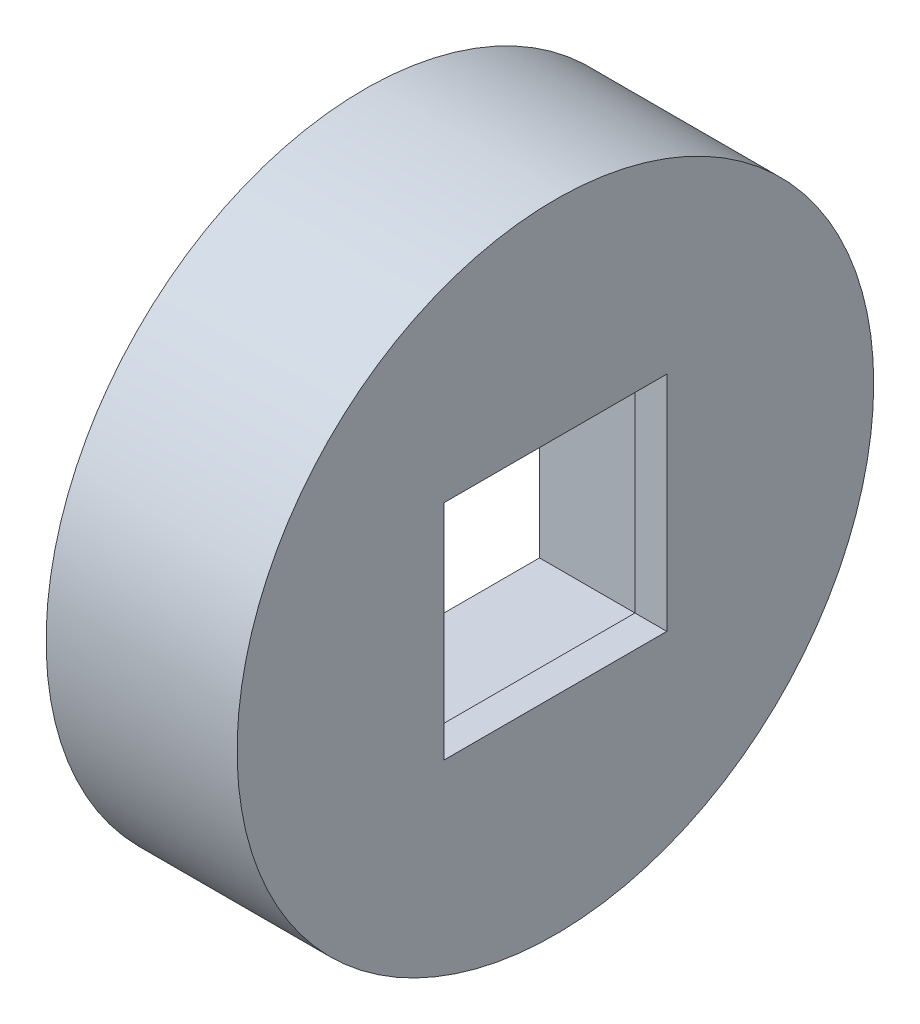
ISO-10303-21;
HEADER;
FILE_DESCRIPTION(('STEP AP214'),'2;1');
FILE_NAME('part.step','',(''),(''),'','','');
FILE_SCHEMA(('AUTOMOTIVE_DESIGN { 1 0 10303 214 1 1 1 1 }'));
ENDSEC;
DATA;
#1=APPLICATION_CONTEXT('core data for automotive mechanical design processes');
#2=APPLICATION_PROTOCOL_DEFINITION('international standard','automotive_design',2000,#1);
#3=PRODUCT_CONTEXT('',#1,'mechanical');
#4=PRODUCT('Part','Part','',(#3));
#5=PRODUCT_RELATED_PRODUCT_CATEGORY('part','',(#4));
#6=PRODUCT_DEFINITION_FORMATION('','',#4);
#7=PRODUCT_DEFINITION_CONTEXT('part definition',#1,'design');
#8=PRODUCT_DEFINITION('design','',#6,#7);
#9=PRODUCT_DEFINITION_SHAPE('','',#8);
#10=(LENGTH_UNIT() NAMED_UNIT(*) SI_UNIT(.MILLI.,.METRE.));
#11=(NAMED_UNIT(*) PLANE_ANGLE_UNIT() SI_UNIT($,.RADIAN.));
#12=(NAMED_UNIT(*) SI_UNIT($,.STERADIAN.) SOLID_ANGLE_UNIT());
#13=UNCERTAINTY_MEASURE_WITH_UNIT(LENGTH_MEASURE(1.E-05),#10,'distance_accuracy_value','');
#14=(GEOMETRIC_REPRESENTATION_CONTEXT(3) GLOBAL_UNCERTAINTY_ASSIGNED_CONTEXT((#13)) GLOBAL_UNIT_ASSIGNED_CONTEXT((#10,
#11,#12)) REPRESENTATION_CONTEXT('',''));
#15=CARTESIAN_POINT('',(0.,0.,0.));
#16=DIRECTION('',(0.,0.,1.));
#17=DIRECTION('',(1.,0.,0.));
#18=AXIS2_PLACEMENT_3D('',#15,#16,#17);
#19=CARTESIAN_POINT('',(0.,0.,0.));
#20=DIRECTION('',(1.,0.,0.));
#21=DIRECTION('',(0.,0.,-1.));
#22=AXIS2_PLACEMENT_3D('',#19,#20,#21);
#23=PLANE('',#22);
#24=CARTESIAN_POINT('',(0.,0.,0.));
#25=DIRECTION('',(1.,0.,0.));
#26=DIRECTION('',(0.,0.,-1.));
#27=AXIS2_PLACEMENT_3D('',#24,#25,#26);
#28=CIRCLE('',#27,5.);
#29=CARTESIAN_POINT('',(0.,0.,-5.));
#30=VERTEX_POINT('',#29);
#31=EDGE_CURVE('E11',#30,#30,#28,.T.);
#32=ORIENTED_EDGE('',*,*,#31,.F.);
#33=EDGE_LOOP('',(#32));
#34=FACE_BOUND('',#33,.T.);
#35=DIRECTION('',(0.,1.,0.));
#36=VECTOR('',#35,1.);
#37=CARTESIAN_POINT('',(0.,-2.75,-2.75));
#38=LINE('',#37,#36);
#39=CARTESIAN_POINT('',(0.,-2.75,-2.75));
#40=VERTEX_POINT('',#39);
#41=CARTESIAN_POINT('',(0.,2.75,-2.75));
#42=VERTEX_POINT('',#41);
#43=EDGE_CURVE('E59',#40,#42,#38,.T.);
#44=ORIENTED_EDGE('',*,*,#43,.T.);
#45=DIRECTION('',(0.,0.,1.));
#46=VECTOR('',#45,1.);
#47=CARTESIAN_POINT('',(0.,2.75,2.75));
#48=LINE('',#47,#46);
#49=CARTESIAN_POINT('',(0.,2.75,2.75));
#50=VERTEX_POINT('',#49);
#51=EDGE_CURVE('E160',#42,#50,#48,.T.);
#52=ORIENTED_EDGE('',*,*,#51,.T.);
#53=DIRECTION('',(0.,-1.,0.));
#54=VECTOR('',#53,1.);
#55=CARTESIAN_POINT('',(0.,-2.75,2.75));
#56=LINE('',#55,#54);
#57=CARTESIAN_POINT('',(0.,-2.75,2.75));
#58=VERTEX_POINT('',#57);
#59=EDGE_CURVE('E163',#50,#58,#56,.T.);
#60=ORIENTED_EDGE('',*,*,#59,.T.);
#61=DIRECTION('',(0.,0.,-1.));
#62=VECTOR('',#61,1.);
#63=CARTESIAN_POINT('',(0.,-2.75,2.75));
#64=LINE('',#63,#62);
#65=EDGE_CURVE('E151',#58,#40,#64,.T.);
#66=ORIENTED_EDGE('',*,*,#65,.T.);
#67=EDGE_LOOP('',(#44,#52,#60,#66));
#68=FACE_BOUND('',#67,.T.);
#69=ADVANCED_FACE('F36',(#34,#68),#23,.F.);
#70=CARTESIAN_POINT('',(2.5,0.,0.));
#71=DIRECTION('',(-1.,0.,0.));
#72=DIRECTION('',(0.,0.,1.));
#73=AXIS2_PLACEMENT_3D('',#70,#71,#72);
#74=CYLINDRICAL_SURFACE('',#73,5.);
#75=ORIENTED_EDGE('',*,*,#31,.T.);
#76=EDGE_LOOP('',(#75));
#77=FACE_BOUND('',#76,.T.);
#78=CARTESIAN_POINT('',(3.,0.,0.));
#79=DIRECTION('',(1.,0.,0.));
#80=DIRECTION('',(0.,0.,-1.));
#81=AXIS2_PLACEMENT_3D('',#78,#79,#80);
#82=CIRCLE('',#81,5.);
#83=CARTESIAN_POINT('',(3.,0.,-5.));
#84=VERTEX_POINT('',#83);
#85=EDGE_CURVE('E124',#84,#84,#82,.T.);
#86=ORIENTED_EDGE('',*,*,#85,.F.);
#87=EDGE_LOOP('',(#86));
#88=FACE_BOUND('',#87,.T.);
#89=ADVANCED_FACE('F38',(#77,#88),#74,.T.);
#90=CARTESIAN_POINT('',(2.5,-2.75,-2.75));
#91=DIRECTION('',(0.,0.,1.));
#92=DIRECTION('',(1.,0.,0.));
#93=AXIS2_PLACEMENT_3D('',#90,#91,#92);
#94=PLANE('',#93);
#95=ORIENTED_EDGE('',*,*,#43,.F.);
#96=DIRECTION('',(-1.,0.,0.));
#97=VECTOR('',#96,1.);
#98=CARTESIAN_POINT('',(2.5,-2.75,-2.75));
#99=LINE('',#98,#97);
#100=CARTESIAN_POINT('',(2.5,-2.75,-2.75));
#101=VERTEX_POINT('',#100);
#102=EDGE_CURVE('E158',#101,#40,#99,.T.);
#103=ORIENTED_EDGE('',*,*,#102,.F.);
#104=DIRECTION('',(0.,1.,0.));
#105=VECTOR('',#104,1.);
#106=CARTESIAN_POINT('',(2.5,-2.75,-2.75));
#107=LINE('',#106,#105);
#108=CARTESIAN_POINT('',(2.5,2.75,-2.75));
#109=VERTEX_POINT('',#108);
#110=EDGE_CURVE('E147',#101,#109,#107,.T.);
#111=ORIENTED_EDGE('',*,*,#110,.T.);
#112=DIRECTION('',(-1.,0.,0.));
#113=VECTOR('',#112,1.);
#114=CARTESIAN_POINT('',(2.5,2.75,-2.75));
#115=LINE('',#114,#113);
#116=EDGE_CURVE('E44',#109,#42,#115,.T.);
#117=ORIENTED_EDGE('',*,*,#116,.T.);
#118=EDGE_LOOP('',(#95,#103,#111,#117));
#119=FACE_BOUND('',#118,.T.);
#120=ADVANCED_FACE('F173',(#119),#94,.T.);
#121=CARTESIAN_POINT('',(2.5,2.75,2.75));
#122=DIRECTION('',(0.,-1.,0.));
#123=DIRECTION('',(0.,0.,-1.));
#124=AXIS2_PLACEMENT_3D('',#121,#122,#123);
#125=PLANE('',#124);
#126=ORIENTED_EDGE('',*,*,#51,.F.);
#127=ORIENTED_EDGE('',*,*,#116,.F.);
#128=DIRECTION('',(0.,0.,1.));
#129=VECTOR('',#128,1.);
#130=CARTESIAN_POINT('',(2.5,2.75,2.75));
#131=LINE('',#130,#129);
#132=CARTESIAN_POINT('',(2.5,2.75,2.75));
#133=VERTEX_POINT('',#132);
#134=EDGE_CURVE('E150',#109,#133,#131,.T.);
#135=ORIENTED_EDGE('',*,*,#134,.T.);
#136=DIRECTION('',(-1.,0.,0.));
#137=VECTOR('',#136,1.);
#138=CARTESIAN_POINT('',(2.5,2.75,2.75));
#139=LINE('',#138,#137);
#140=EDGE_CURVE('E171',#133,#50,#139,.T.);
#141=ORIENTED_EDGE('',*,*,#140,.T.);
#142=EDGE_LOOP('',(#126,#127,#135,#141));
#143=FACE_BOUND('',#142,.T.);
#144=ADVANCED_FACE('F185',(#143),#125,.T.);
#145=CARTESIAN_POINT('',(2.5,-2.75,2.75));
#146=DIRECTION('',(0.,0.,-1.));
#147=DIRECTION('',(-1.,0.,0.));
#148=AXIS2_PLACEMENT_3D('',#145,#146,#147);
#149=PLANE('',#148);
#150=ORIENTED_EDGE('',*,*,#59,.F.);
#151=ORIENTED_EDGE('',*,*,#140,.F.);
#152=DIRECTION('',(0.,-1.,0.));
#153=VECTOR('',#152,1.);
#154=CARTESIAN_POINT('',(2.5,-2.75,2.75));
#155=LINE('',#154,#153);
#156=CARTESIAN_POINT('',(2.5,-2.75,2.75));
#157=VERTEX_POINT('',#156);
#158=EDGE_CURVE('E154',#133,#157,#155,.T.);
#159=ORIENTED_EDGE('',*,*,#158,.T.);
#160=DIRECTION('',(-1.,0.,0.));
#161=VECTOR('',#160,1.);
#162=CARTESIAN_POINT('',(2.5,-2.75,2.75));
#163=LINE('',#162,#161);
#164=EDGE_CURVE('E169',#157,#58,#163,.T.);
#165=ORIENTED_EDGE('',*,*,#164,.T.);
#166=EDGE_LOOP('',(#150,#151,#159,#165));
#167=FACE_BOUND('',#166,.T.);
#168=ADVANCED_FACE('F182',(#167),#149,.T.);
#169=CARTESIAN_POINT('',(2.5,-2.75,2.75));
#170=DIRECTION('',(0.,1.,0.));
#171=DIRECTION('',(0.,0.,1.));
#172=AXIS2_PLACEMENT_3D('',#169,#170,#171);
#173=PLANE('',#172);
#174=ORIENTED_EDGE('',*,*,#65,.F.);
#175=ORIENTED_EDGE('',*,*,#164,.F.);
#176=DIRECTION('',(0.,0.,-1.));
#177=VECTOR('',#176,1.);
#178=CARTESIAN_POINT('',(2.5,-2.75,2.75));
#179=LINE('',#178,#177);
#180=EDGE_CURVE('E51',#157,#101,#179,.T.);
#181=ORIENTED_EDGE('',*,*,#180,.T.);
#182=ORIENTED_EDGE('',*,*,#102,.T.);
#183=EDGE_LOOP('',(#174,#175,#181,#182));
#184=FACE_BOUND('',#183,.T.);
#185=ADVANCED_FACE('F179',(#184),#173,.T.);
#186=CARTESIAN_POINT('',(3.,0.,-1.75));
#187=DIRECTION('',(0.,0.,1.));
#188=DIRECTION('',(1.,0.,0.));
#189=AXIS2_PLACEMENT_3D('',#186,#187,#188);
#190=PLANE('',#189);
#191=DIRECTION('',(0.,1.,0.));
#192=VECTOR('',#191,1.);
#193=CARTESIAN_POINT('',(2.5,0.,-1.75));
#194=LINE('',#193,#192);
#195=CARTESIAN_POINT('',(2.5,-1.75,-1.75));
#196=VERTEX_POINT('',#195);
#197=CARTESIAN_POINT('',(2.5,1.75,-1.75));
#198=VERTEX_POINT('',#197);
#199=EDGE_CURVE('E109',#196,#198,#194,.T.);
#200=ORIENTED_EDGE('',*,*,#199,.F.);
#201=DIRECTION('',(-1.,0.,0.));
#202=VECTOR('',#201,1.);
#203=CARTESIAN_POINT('',(3.,-1.75,-1.75));
#204=LINE('',#203,#202);
#205=CARTESIAN_POINT('',(3.,-1.75,-1.75));
#206=VERTEX_POINT('',#205);
#207=EDGE_CURVE('E103',#206,#196,#204,.T.);
#208=ORIENTED_EDGE('',*,*,#207,.F.);
#209=DIRECTION('',(0.,1.,0.));
#210=VECTOR('',#209,1.);
#211=CARTESIAN_POINT('',(3.,0.,-1.75));
#212=LINE('',#211,#210);
#213=CARTESIAN_POINT('',(3.,1.75,-1.75));
#214=VERTEX_POINT('',#213);
#215=EDGE_CURVE('E106',#206,#214,#212,.T.);
#216=ORIENTED_EDGE('',*,*,#215,.T.);
#217=DIRECTION('',(-1.,0.,0.));
#218=VECTOR('',#217,1.);
#219=CARTESIAN_POINT('',(3.,1.75,-1.75));
#220=LINE('',#219,#218);
#221=EDGE_CURVE('E133',#214,#198,#220,.T.);
#222=ORIENTED_EDGE('',*,*,#221,.T.);
#223=EDGE_LOOP('',(#200,#208,#216,#222));
#224=FACE_BOUND('',#223,.T.);
#225=ADVANCED_FACE('F105',(#224),#190,.T.);
#226=CARTESIAN_POINT('',(3.,-1.75,0.));
#227=DIRECTION('',(0.,1.,0.));
#228=DIRECTION('',(0.,0.,1.));
#229=AXIS2_PLACEMENT_3D('',#226,#227,#228);
#230=PLANE('',#229);
#231=DIRECTION('',(0.,0.,-1.));
#232=VECTOR('',#231,1.);
#233=CARTESIAN_POINT('',(2.5,-1.75,0.));
#234=LINE('',#233,#232);
#235=CARTESIAN_POINT('',(2.5,-1.75,1.75));
#236=VERTEX_POINT('',#235);
#237=EDGE_CURVE('E135',#236,#196,#234,.T.);
#238=ORIENTED_EDGE('',*,*,#237,.F.);
#239=DIRECTION('',(-1.,0.,0.));
#240=VECTOR('',#239,1.);
#241=CARTESIAN_POINT('',(3.,-1.75,1.75));
#242=LINE('',#241,#240);
#243=CARTESIAN_POINT('',(3.,-1.75,1.75));
#244=VERTEX_POINT('',#243);
#245=EDGE_CURVE('E114',#244,#236,#242,.T.);
#246=ORIENTED_EDGE('',*,*,#245,.F.);
#247=DIRECTION('',(0.,0.,-1.));
#248=VECTOR('',#247,1.);
#249=CARTESIAN_POINT('',(3.,-1.75,0.));
#250=LINE('',#249,#248);
#251=EDGE_CURVE('E120',#244,#206,#250,.T.);
#252=ORIENTED_EDGE('',*,*,#251,.T.);
#253=ORIENTED_EDGE('',*,*,#207,.T.);
#254=EDGE_LOOP('',(#238,#246,#252,#253));
#255=FACE_BOUND('',#254,.T.);
#256=ADVANCED_FACE('F126',(#255),#230,.T.);
#257=CARTESIAN_POINT('',(3.,0.,1.75));
#258=DIRECTION('',(0.,0.,-1.));
#259=DIRECTION('',(-1.,0.,0.));
#260=AXIS2_PLACEMENT_3D('',#257,#258,#259);
#261=PLANE('',#260);
#262=DIRECTION('',(0.,-1.,0.));
#263=VECTOR('',#262,1.);
#264=CARTESIAN_POINT('',(2.5,0.,1.75));
#265=LINE('',#264,#263);
#266=CARTESIAN_POINT('',(2.5,1.75,1.75));
#267=VERTEX_POINT('',#266);
#268=EDGE_CURVE('E137',#267,#236,#265,.T.);
#269=ORIENTED_EDGE('',*,*,#268,.F.);
#270=DIRECTION('',(-1.,0.,0.));
#271=VECTOR('',#270,1.);
#272=CARTESIAN_POINT('',(3.,1.75,1.75));
#273=LINE('',#272,#271);
#274=CARTESIAN_POINT('',(3.,1.75,1.75));
#275=VERTEX_POINT('',#274);
#276=EDGE_CURVE('E144',#275,#267,#273,.T.);
#277=ORIENTED_EDGE('',*,*,#276,.F.);
#278=DIRECTION('',(0.,-1.,0.));
#279=VECTOR('',#278,1.);
#280=CARTESIAN_POINT('',(3.,0.,1.75));
#281=LINE('',#280,#279);
#282=EDGE_CURVE('E127',#275,#244,#281,.T.);
#283=ORIENTED_EDGE('',*,*,#282,.T.);
#284=ORIENTED_EDGE('',*,*,#245,.T.);
#285=EDGE_LOOP('',(#269,#277,#283,#284));
#286=FACE_BOUND('',#285,.T.);
#287=ADVANCED_FACE('F213',(#286),#261,.T.);
#288=CARTESIAN_POINT('',(3.,1.75,0.));
#289=DIRECTION('',(0.,-1.,0.));
#290=DIRECTION('',(0.,0.,-1.));
#291=AXIS2_PLACEMENT_3D('',#288,#289,#290);
#292=PLANE('',#291);
#293=DIRECTION('',(0.,0.,1.));
#294=VECTOR('',#293,1.);
#295=CARTESIAN_POINT('',(2.5,1.75,0.));
#296=LINE('',#295,#294);
#297=EDGE_CURVE('E140',#198,#267,#296,.T.);
#298=ORIENTED_EDGE('',*,*,#297,.F.);
#299=ORIENTED_EDGE('',*,*,#221,.F.);
#300=DIRECTION('',(0.,0.,1.));
#301=VECTOR('',#300,1.);
#302=CARTESIAN_POINT('',(3.,1.75,0.));
#303=LINE('',#302,#301);
#304=EDGE_CURVE('E123',#214,#275,#303,.T.);
#305=ORIENTED_EDGE('',*,*,#304,.T.);
#306=ORIENTED_EDGE('',*,*,#276,.T.);
#307=EDGE_LOOP('',(#298,#299,#305,#306));
#308=FACE_BOUND('',#307,.T.);
#309=ADVANCED_FACE('F206',(#308),#292,.T.);
#310=CARTESIAN_POINT('',(3.,0.,0.));
#311=DIRECTION('',(1.,0.,0.));
#312=DIRECTION('',(0.,0.,-1.));
#313=AXIS2_PLACEMENT_3D('',#310,#311,#312);
#314=PLANE('',#313);
#315=ORIENTED_EDGE('',*,*,#85,.T.);
#316=EDGE_LOOP('',(#315));
#317=FACE_BOUND('',#316,.T.);
#318=ORIENTED_EDGE('',*,*,#215,.F.);
#319=ORIENTED_EDGE('',*,*,#251,.F.);
#320=ORIENTED_EDGE('',*,*,#282,.F.);
#321=ORIENTED_EDGE('',*,*,#304,.F.);
#322=EDGE_LOOP('',(#318,#319,#320,#321));
#323=FACE_BOUND('',#322,.T.);
#324=ADVANCED_FACE('F118',(#317,#323),#314,.T.);
#325=CARTESIAN_POINT('',(2.5,0.,0.));
#326=DIRECTION('',(1.,0.,0.));
#327=DIRECTION('',(0.,0.,-1.));
#328=AXIS2_PLACEMENT_3D('',#325,#326,#327);
#329=PLANE('',#328);
#330=ORIENTED_EDGE('',*,*,#134,.F.);
#331=ORIENTED_EDGE('',*,*,#110,.F.);
#332=ORIENTED_EDGE('',*,*,#180,.F.);
#333=ORIENTED_EDGE('',*,*,#158,.F.);
#334=EDGE_LOOP('',(#330,#331,#332,#333));
#335=FACE_BOUND('',#334,.T.);
#336=ORIENTED_EDGE('',*,*,#199,.T.);
#337=ORIENTED_EDGE('',*,*,#297,.T.);
#338=ORIENTED_EDGE('',*,*,#268,.T.);
#339=ORIENTED_EDGE('',*,*,#237,.T.);
#340=EDGE_LOOP('',(#336,#337,#338,#339));
#341=FACE_BOUND('',#340,.T.);
#342=ADVANCED_FACE('F183',(#335,#341),#329,.F.);
#343=CLOSED_SHELL('',(#69,#89,#120,#144,#168,#185,#225,#256,#287,#309,#324,#342));
#344=MANIFOLD_SOLID_BREP('B2',#343);
#345=ADVANCED_BREP_SHAPE_REPRESENTATION('',(#18,#344),#14);
#346=SHAPE_DEFINITION_REPRESENTATION(#9,#345);
ENDSEC;
END-ISO-10303-21;
